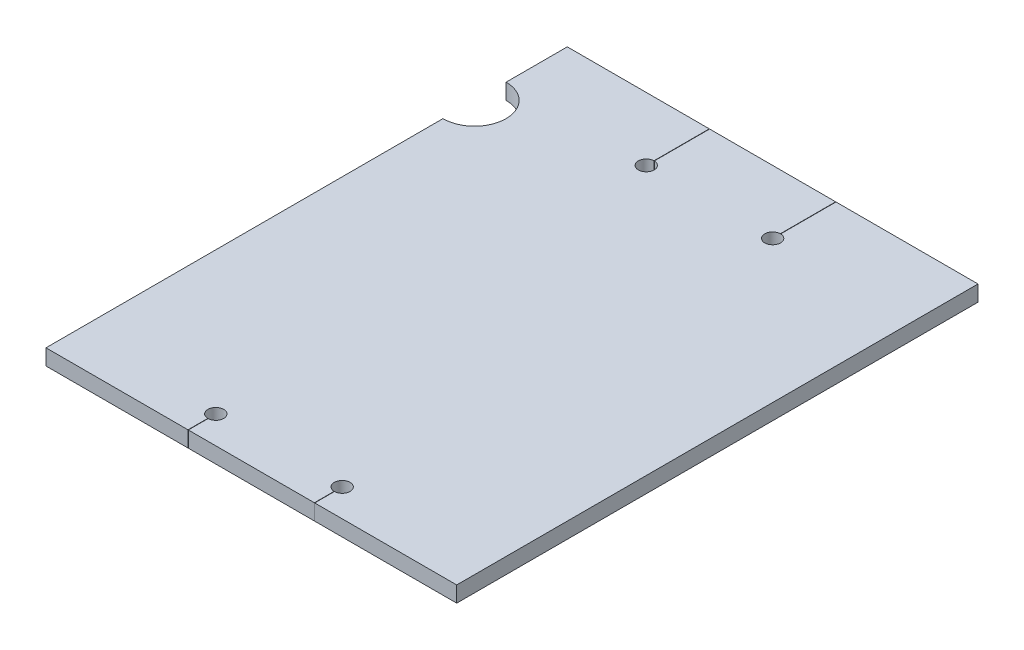
ISO-10303-21;
HEADER;
FILE_DESCRIPTION(('STEP AP214'),'2;1');
FILE_NAME('part.step','',(''),(''),'','','');
FILE_SCHEMA(('AUTOMOTIVE_DESIGN { 1 0 10303 214 1 1 1 1 }'));
ENDSEC;
DATA;
#1=APPLICATION_CONTEXT('core data for automotive mechanical design processes');
#2=APPLICATION_PROTOCOL_DEFINITION('international standard','automotive_design',2000,#1);
#3=PRODUCT_CONTEXT('',#1,'mechanical');
#4=PRODUCT('Part','Part','',(#3));
#5=PRODUCT_RELATED_PRODUCT_CATEGORY('part','',(#4));
#6=PRODUCT_DEFINITION_FORMATION('','',#4);
#7=PRODUCT_DEFINITION_CONTEXT('part definition',#1,'design');
#8=PRODUCT_DEFINITION('design','',#6,#7);
#9=PRODUCT_DEFINITION_SHAPE('','',#8);
#10=(LENGTH_UNIT() NAMED_UNIT(*) SI_UNIT(.MILLI.,.METRE.));
#11=(NAMED_UNIT(*) PLANE_ANGLE_UNIT() SI_UNIT($,.RADIAN.));
#12=(NAMED_UNIT(*) SI_UNIT($,.STERADIAN.) SOLID_ANGLE_UNIT());
#13=UNCERTAINTY_MEASURE_WITH_UNIT(LENGTH_MEASURE(1.E-05),#10,'distance_accuracy_value','');
#14=(GEOMETRIC_REPRESENTATION_CONTEXT(3) GLOBAL_UNCERTAINTY_ASSIGNED_CONTEXT((#13)) GLOBAL_UNIT_ASSIGNED_CONTEXT((#10,
#11,#12)) REPRESENTATION_CONTEXT('',''));
#15=CARTESIAN_POINT('',(0.,0.,0.));
#16=DIRECTION('',(0.,0.,1.));
#17=DIRECTION('',(1.,0.,0.));
#18=AXIS2_PLACEMENT_3D('',#15,#16,#17);
#19=CARTESIAN_POINT('',(-165.1,12.7,-457.2));
#20=DIRECTION('',(0.,-1.,0.));
#21=DIRECTION('',(0.,0.,-1.));
#22=AXIS2_PLACEMENT_3D('',#19,#20,#21);
#23=PLANE('',#22);
#24=DIRECTION('',(0.,0.,1.));
#25=VECTOR('',#24,1.);
#26=CARTESIAN_POINT('',(-50.927,12.7,-53.9762701270254));
#27=LINE('',#26,#25);
#28=CARTESIAN_POINT('',(-50.927,12.7,-53.9762701270254));
#29=VERTEX_POINT('',#28);
#30=CARTESIAN_POINT('',(-50.927,12.7,-38.1));
#31=VERTEX_POINT('',#30);
#32=EDGE_CURVE('E205',#29,#31,#27,.T.);
#33=ORIENTED_EDGE('',*,*,#32,.F.);
#34=CARTESIAN_POINT('',(-50.8,12.7,-60.325));
#35=DIRECTION('',(0.,1.,0.));
#36=DIRECTION('',(0.,0.,1.));
#37=AXIS2_PLACEMENT_3D('',#34,#35,#36);
#38=CIRCLE('',#37,6.35000000000001);
#39=CARTESIAN_POINT('',(-50.673,12.7,-53.9762701270254));
#40=VERTEX_POINT('',#39);
#41=EDGE_CURVE('E195',#40,#29,#38,.T.);
#42=ORIENTED_EDGE('',*,*,#41,.F.);
#43=DIRECTION('',(0.,0.,-1.));
#44=VECTOR('',#43,1.);
#45=CARTESIAN_POINT('',(-50.673,12.7,-53.9762701270254));
#46=LINE('',#45,#44);
#47=CARTESIAN_POINT('',(-50.673,12.7,-38.1));
#48=VERTEX_POINT('',#47);
#49=EDGE_CURVE('E207',#48,#40,#46,.T.);
#50=ORIENTED_EDGE('',*,*,#49,.F.);
#51=DIRECTION('',(-1.,0.,0.));
#52=VECTOR('',#51,1.);
#53=CARTESIAN_POINT('',(-231.560967647059,12.7,-38.1));
#54=LINE('',#53,#52);
#55=CARTESIAN_POINT('',(50.673,12.7,-38.1));
#56=VERTEX_POINT('',#55);
#57=EDGE_CURVE('E282',#56,#48,#54,.T.);
#58=ORIENTED_EDGE('',*,*,#57,.F.);
#59=DIRECTION('',(0.,0.,1.));
#60=VECTOR('',#59,1.);
#61=CARTESIAN_POINT('',(50.673,12.7,-53.9762701270254));
#62=LINE('',#61,#60);
#63=CARTESIAN_POINT('',(50.673,12.7,-53.9762701270254));
#64=VERTEX_POINT('',#63);
#65=EDGE_CURVE('E239',#64,#56,#62,.T.);
#66=ORIENTED_EDGE('',*,*,#65,.F.);
#67=CARTESIAN_POINT('',(50.8,12.7,-60.325));
#68=DIRECTION('',(0.,1.,0.));
#69=DIRECTION('',(0.,0.,-1.));
#70=AXIS2_PLACEMENT_3D('',#67,#68,#69);
#71=CIRCLE('',#70,6.35);
#72=CARTESIAN_POINT('',(50.927,12.7,-53.9762701270254));
#73=VERTEX_POINT('',#72);
#74=EDGE_CURVE('E237',#73,#64,#71,.T.);
#75=ORIENTED_EDGE('',*,*,#74,.F.);
#76=DIRECTION('',(0.,0.,-1.));
#77=VECTOR('',#76,1.);
#78=CARTESIAN_POINT('',(50.927,12.7,-53.9762701270254));
#79=LINE('',#78,#77);
#80=CARTESIAN_POINT('',(50.927,12.7,-38.1));
#81=VERTEX_POINT('',#80);
#82=EDGE_CURVE('E241',#81,#73,#79,.T.);
#83=ORIENTED_EDGE('',*,*,#82,.F.);
#84=CARTESIAN_POINT('',(165.1,12.7,-38.1));
#85=VERTEX_POINT('',#84);
#86=EDGE_CURVE('E278',#85,#81,#54,.T.);
#87=ORIENTED_EDGE('',*,*,#86,.F.);
#88=DIRECTION('',(0.,0.,-1.));
#89=VECTOR('',#88,1.);
#90=CARTESIAN_POINT('',(165.1,12.7,-25.4));
#91=LINE('',#90,#89);
#92=CARTESIAN_POINT('',(165.1,12.7,-457.2));
#93=VERTEX_POINT('',#92);
#94=EDGE_CURVE('E302',#85,#93,#91,.T.);
#95=ORIENTED_EDGE('',*,*,#94,.T.);
#96=DIRECTION('',(-1.,0.,0.));
#97=VECTOR('',#96,1.);
#98=CARTESIAN_POINT('',(-165.1,12.7,-457.2));
#99=LINE('',#98,#97);
#100=CARTESIAN_POINT('',(50.927,12.7,-457.2));
#101=VERTEX_POINT('',#100);
#102=EDGE_CURVE('E305',#93,#101,#99,.T.);
#103=ORIENTED_EDGE('',*,*,#102,.T.);
#104=DIRECTION('',(0.,0.,-1.));
#105=VECTOR('',#104,1.);
#106=CARTESIAN_POINT('',(50.927,12.7,-497.366900495812));
#107=LINE('',#106,#105);
#108=CARTESIAN_POINT('',(50.927,12.7,-412.748729872975));
#109=VERTEX_POINT('',#108);
#110=EDGE_CURVE('E261',#109,#101,#107,.T.);
#111=ORIENTED_EDGE('',*,*,#110,.F.);
#112=CARTESIAN_POINT('',(50.8,12.7,-406.4));
#113=DIRECTION('',(0.,1.,0.));
#114=DIRECTION('',(0.,0.,-1.));
#115=AXIS2_PLACEMENT_3D('',#112,#113,#114);
#116=CIRCLE('',#115,6.34999999999999);
#117=CARTESIAN_POINT('',(50.673,12.7,-412.748729872975));
#118=VERTEX_POINT('',#117);
#119=EDGE_CURVE('E259',#118,#109,#116,.T.);
#120=ORIENTED_EDGE('',*,*,#119,.F.);
#121=DIRECTION('',(0.,0.,1.));
#122=VECTOR('',#121,1.);
#123=CARTESIAN_POINT('',(50.673,12.7,-497.366900495812));
#124=LINE('',#123,#122);
#125=CARTESIAN_POINT('',(50.673,12.7,-457.2));
#126=VERTEX_POINT('',#125);
#127=EDGE_CURVE('E257',#126,#118,#124,.T.);
#128=ORIENTED_EDGE('',*,*,#127,.F.);
#129=CARTESIAN_POINT('',(-50.673,12.7,-457.2));
#130=VERTEX_POINT('',#129);
#131=EDGE_CURVE('E309',#126,#130,#99,.T.);
#132=ORIENTED_EDGE('',*,*,#131,.T.);
#133=DIRECTION('',(0.,0.,-1.));
#134=VECTOR('',#133,1.);
#135=CARTESIAN_POINT('',(-50.673,12.7,-495.604822124658));
#136=LINE('',#135,#134);
#137=CARTESIAN_POINT('',(-50.673,12.7,-412.748729872975));
#138=VERTEX_POINT('',#137);
#139=EDGE_CURVE('E53',#138,#130,#136,.T.);
#140=ORIENTED_EDGE('',*,*,#139,.F.);
#141=CARTESIAN_POINT('',(-50.8,12.7,-406.4));
#142=DIRECTION('',(0.,1.,0.));
#143=DIRECTION('',(0.,0.,1.));
#144=AXIS2_PLACEMENT_3D('',#141,#142,#143);
#145=CIRCLE('',#144,6.35000000000004);
#146=CARTESIAN_POINT('',(-50.927,12.7,-412.748729872975));
#147=VERTEX_POINT('',#146);
#148=EDGE_CURVE('E220',#147,#138,#145,.T.);
#149=ORIENTED_EDGE('',*,*,#148,.F.);
#150=DIRECTION('',(0.,0.,1.));
#151=VECTOR('',#150,1.);
#152=CARTESIAN_POINT('',(-50.927,12.7,-495.604822124658));
#153=LINE('',#152,#151);
#154=CARTESIAN_POINT('',(-50.927,12.7,-457.2));
#155=VERTEX_POINT('',#154);
#156=EDGE_CURVE('E218',#155,#147,#153,.T.);
#157=ORIENTED_EDGE('',*,*,#156,.F.);
#158=CARTESIAN_POINT('',(-165.1,12.7,-457.2));
#159=VERTEX_POINT('',#158);
#160=EDGE_CURVE('E304',#155,#159,#99,.T.);
#161=ORIENTED_EDGE('',*,*,#160,.T.);
#162=DIRECTION('',(0.,0.,1.));
#163=VECTOR('',#162,1.);
#164=CARTESIAN_POINT('',(-165.1,12.7,-25.4));
#165=LINE('',#164,#163);
#166=CARTESIAN_POINT('',(-165.1,12.7,-408.0002));
#167=VERTEX_POINT('',#166);
#168=EDGE_CURVE('E299',#159,#167,#165,.T.);
#169=ORIENTED_EDGE('',*,*,#168,.T.);
#170=CARTESIAN_POINT('',(-165.1,12.7,-382.6002));
#171=DIRECTION('',(0.,1.,0.));
#172=DIRECTION('',(0.,0.,1.));
#173=AXIS2_PLACEMENT_3D('',#170,#171,#172);
#174=CIRCLE('',#173,25.4);
#175=CARTESIAN_POINT('',(-165.1,12.7,-357.2002));
#176=VERTEX_POINT('',#175);
#177=EDGE_CURVE('E271',#176,#167,#174,.T.);
#178=ORIENTED_EDGE('',*,*,#177,.F.);
#179=CARTESIAN_POINT('',(-165.1,12.7,-38.1));
#180=VERTEX_POINT('',#179);
#181=EDGE_CURVE('E297',#176,#180,#165,.T.);
#182=ORIENTED_EDGE('',*,*,#181,.T.);
#183=EDGE_CURVE('E277',#31,#180,#54,.T.);
#184=ORIENTED_EDGE('',*,*,#183,.F.);
#185=EDGE_LOOP('',(#33,#42,#50,#58,#66,#75,#83,#87,#95,#103,#111,#120,#128,#132,#140,#149,#157,
#161,#169,#178,#182,#184));
#186=FACE_BOUND('',#185,.T.);
#187=ADVANCED_FACE('F30',(#186),#23,.F.);
#188=CARTESIAN_POINT('',(-165.1,0.,-457.2));
#189=DIRECTION('',(0.,-1.,0.));
#190=DIRECTION('',(0.,0.,-1.));
#191=AXIS2_PLACEMENT_3D('',#188,#189,#190);
#192=PLANE('',#191);
#193=CARTESIAN_POINT('',(-50.8,0.,-60.325));
#194=DIRECTION('',(0.,1.,0.));
#195=DIRECTION('',(0.,0.,1.));
#196=AXIS2_PLACEMENT_3D('',#193,#194,#195);
#197=CIRCLE('',#196,6.35000000000001);
#198=CARTESIAN_POINT('',(-50.673,0.,-53.9762701270254));
#199=VERTEX_POINT('',#198);
#200=CARTESIAN_POINT('',(-50.927,0.,-53.9762701270254));
#201=VERTEX_POINT('',#200);
#202=EDGE_CURVE('E188',#199,#201,#197,.T.);
#203=ORIENTED_EDGE('',*,*,#202,.T.);
#204=DIRECTION('',(0.,0.,1.));
#205=VECTOR('',#204,1.);
#206=CARTESIAN_POINT('',(-50.927,0.,-53.9762701270254));
#207=LINE('',#206,#205);
#208=CARTESIAN_POINT('',(-50.927,0.,-38.1));
#209=VERTEX_POINT('',#208);
#210=EDGE_CURVE('E180',#201,#209,#207,.T.);
#211=ORIENTED_EDGE('',*,*,#210,.T.);
#212=DIRECTION('',(-1.,0.,0.));
#213=VECTOR('',#212,1.);
#214=CARTESIAN_POINT('',(-165.1,0.,-38.1));
#215=LINE('',#214,#213);
#216=CARTESIAN_POINT('',(-165.1,0.,-38.1));
#217=VERTEX_POINT('',#216);
#218=EDGE_CURVE('E315',#209,#217,#215,.T.);
#219=ORIENTED_EDGE('',*,*,#218,.T.);
#220=DIRECTION('',(0.,0.,1.));
#221=VECTOR('',#220,1.);
#222=CARTESIAN_POINT('',(-165.1,0.,-25.4));
#223=LINE('',#222,#221);
#224=CARTESIAN_POINT('',(-165.1,0.,-357.2002));
#225=VERTEX_POINT('',#224);
#226=EDGE_CURVE('E287',#225,#217,#223,.T.);
#227=ORIENTED_EDGE('',*,*,#226,.F.);
#228=CARTESIAN_POINT('',(-165.1,0.,-382.6002));
#229=DIRECTION('',(0.,1.,0.));
#230=DIRECTION('',(0.,0.,1.));
#231=AXIS2_PLACEMENT_3D('',#228,#229,#230);
#232=CIRCLE('',#231,25.4);
#233=CARTESIAN_POINT('',(-165.1,0.,-408.0002));
#234=VERTEX_POINT('',#233);
#235=EDGE_CURVE('E268',#225,#234,#232,.T.);
#236=ORIENTED_EDGE('',*,*,#235,.T.);
#237=CARTESIAN_POINT('',(-165.1,0.,-457.2));
#238=VERTEX_POINT('',#237);
#239=EDGE_CURVE('E288',#238,#234,#223,.T.);
#240=ORIENTED_EDGE('',*,*,#239,.F.);
#241=DIRECTION('',(-1.,0.,0.));
#242=VECTOR('',#241,1.);
#243=CARTESIAN_POINT('',(-165.1,0.,-457.2));
#244=LINE('',#243,#242);
#245=CARTESIAN_POINT('',(-50.927,0.,-457.2));
#246=VERTEX_POINT('',#245);
#247=EDGE_CURVE('E293',#246,#238,#244,.T.);
#248=ORIENTED_EDGE('',*,*,#247,.F.);
#249=DIRECTION('',(0.,0.,1.));
#250=VECTOR('',#249,1.);
#251=CARTESIAN_POINT('',(-50.927,0.,-495.604822124658));
#252=LINE('',#251,#250);
#253=CARTESIAN_POINT('',(-50.927,0.,-412.748729872975));
#254=VERTEX_POINT('',#253);
#255=EDGE_CURVE('E196',#246,#254,#252,.T.);
#256=ORIENTED_EDGE('',*,*,#255,.T.);
#257=CARTESIAN_POINT('',(-50.8,0.,-406.4));
#258=DIRECTION('',(0.,1.,0.));
#259=DIRECTION('',(0.,0.,1.));
#260=AXIS2_PLACEMENT_3D('',#257,#258,#259);
#261=CIRCLE('',#260,6.35000000000004);
#262=CARTESIAN_POINT('',(-50.673,0.,-412.748729872975));
#263=VERTEX_POINT('',#262);
#264=EDGE_CURVE('E212',#254,#263,#261,.T.);
#265=ORIENTED_EDGE('',*,*,#264,.T.);
#266=DIRECTION('',(0.,0.,-1.));
#267=VECTOR('',#266,1.);
#268=CARTESIAN_POINT('',(-50.673,0.,-495.604822124658));
#269=LINE('',#268,#267);
#270=CARTESIAN_POINT('',(-50.673,0.,-457.2));
#271=VERTEX_POINT('',#270);
#272=EDGE_CURVE('E215',#263,#271,#269,.T.);
#273=ORIENTED_EDGE('',*,*,#272,.T.);
#274=CARTESIAN_POINT('',(50.673,0.,-457.2));
#275=VERTEX_POINT('',#274);
#276=EDGE_CURVE('E298',#275,#271,#244,.T.);
#277=ORIENTED_EDGE('',*,*,#276,.F.);
#278=DIRECTION('',(0.,0.,1.));
#279=VECTOR('',#278,1.);
#280=CARTESIAN_POINT('',(50.673,0.,-497.366900495812));
#281=LINE('',#280,#279);
#282=CARTESIAN_POINT('',(50.673,0.,-412.748729872975));
#283=VERTEX_POINT('',#282);
#284=EDGE_CURVE('E248',#275,#283,#281,.T.);
#285=ORIENTED_EDGE('',*,*,#284,.T.);
#286=CARTESIAN_POINT('',(50.8,0.,-406.4));
#287=DIRECTION('',(0.,1.,0.));
#288=DIRECTION('',(0.,0.,-1.));
#289=AXIS2_PLACEMENT_3D('',#286,#287,#288);
#290=CIRCLE('',#289,6.34999999999999);
#291=CARTESIAN_POINT('',(50.927,0.,-412.748729872975));
#292=VERTEX_POINT('',#291);
#293=EDGE_CURVE('E251',#283,#292,#290,.T.);
#294=ORIENTED_EDGE('',*,*,#293,.T.);
#295=DIRECTION('',(0.,0.,-1.));
#296=VECTOR('',#295,1.);
#297=CARTESIAN_POINT('',(50.927,0.,-497.366900495812));
#298=LINE('',#297,#296);
#299=CARTESIAN_POINT('',(50.927,0.,-457.2));
#300=VERTEX_POINT('',#299);
#301=EDGE_CURVE('E254',#292,#300,#298,.T.);
#302=ORIENTED_EDGE('',*,*,#301,.T.);
#303=CARTESIAN_POINT('',(165.1,0.,-457.2));
#304=VERTEX_POINT('',#303);
#305=EDGE_CURVE('E294',#304,#300,#244,.T.);
#306=ORIENTED_EDGE('',*,*,#305,.F.);
#307=DIRECTION('',(0.,0.,-1.));
#308=VECTOR('',#307,1.);
#309=CARTESIAN_POINT('',(165.1,0.,-25.4));
#310=LINE('',#309,#308);
#311=CARTESIAN_POINT('',(165.1,0.,-38.1));
#312=VERTEX_POINT('',#311);
#313=EDGE_CURVE('E291',#312,#304,#310,.T.);
#314=ORIENTED_EDGE('',*,*,#313,.F.);
#315=CARTESIAN_POINT('',(50.927,0.,-38.1));
#316=VERTEX_POINT('',#315);
#317=EDGE_CURVE('E316',#312,#316,#215,.T.);
#318=ORIENTED_EDGE('',*,*,#317,.T.);
#319=DIRECTION('',(0.,0.,-1.));
#320=VECTOR('',#319,1.);
#321=CARTESIAN_POINT('',(50.927,0.,-53.9762701270254));
#322=LINE('',#321,#320);
#323=CARTESIAN_POINT('',(50.927,0.,-53.9762701270254));
#324=VERTEX_POINT('',#323);
#325=EDGE_CURVE('E234',#316,#324,#322,.T.);
#326=ORIENTED_EDGE('',*,*,#325,.T.);
#327=CARTESIAN_POINT('',(50.8,0.,-60.325));
#328=DIRECTION('',(0.,1.,0.));
#329=DIRECTION('',(0.,0.,-1.));
#330=AXIS2_PLACEMENT_3D('',#327,#328,#329);
#331=CIRCLE('',#330,6.35);
#332=CARTESIAN_POINT('',(50.673,0.,-53.9762701270254));
#333=VERTEX_POINT('',#332);
#334=EDGE_CURVE('E228',#324,#333,#331,.T.);
#335=ORIENTED_EDGE('',*,*,#334,.T.);
#336=DIRECTION('',(0.,0.,1.));
#337=VECTOR('',#336,1.);
#338=CARTESIAN_POINT('',(50.673,0.,-53.9762701270254));
#339=LINE('',#338,#337);
#340=CARTESIAN_POINT('',(50.673,0.,-38.1));
#341=VERTEX_POINT('',#340);
#342=EDGE_CURVE('E231',#333,#341,#339,.T.);
#343=ORIENTED_EDGE('',*,*,#342,.T.);
#344=CARTESIAN_POINT('',(-50.673,0.,-38.1));
#345=VERTEX_POINT('',#344);
#346=EDGE_CURVE('E320',#341,#345,#215,.T.);
#347=ORIENTED_EDGE('',*,*,#346,.T.);
#348=DIRECTION('',(0.,0.,-1.));
#349=VECTOR('',#348,1.);
#350=CARTESIAN_POINT('',(-50.673,0.,-53.9762701270254));
#351=LINE('',#350,#349);
#352=EDGE_CURVE('E45',#345,#199,#351,.T.);
#353=ORIENTED_EDGE('',*,*,#352,.T.);
#354=EDGE_LOOP('',(#203,#211,#219,#227,#236,#240,#248,#256,#265,#273,#277,#285,#294,#302,#306,
#314,#318,#326,#335,#343,#347,#353));
#355=FACE_BOUND('',#354,.T.);
#356=ADVANCED_FACE('F199',(#355),#192,.T.);
#357=CARTESIAN_POINT('',(-231.560967647059,12.7,-38.1));
#358=DIRECTION('',(0.,0.,1.));
#359=DIRECTION('',(1.,0.,0.));
#360=AXIS2_PLACEMENT_3D('',#357,#358,#359);
#361=PLANE('',#360);
#362=ORIENTED_EDGE('',*,*,#218,.F.);
#363=DIRECTION('',(0.,1.,0.));
#364=VECTOR('',#363,1.);
#365=CARTESIAN_POINT('',(-50.927,12.7,-38.1));
#366=LINE('',#365,#364);
#367=EDGE_CURVE('E11',#209,#31,#366,.T.);
#368=ORIENTED_EDGE('',*,*,#367,.T.);
#369=ORIENTED_EDGE('',*,*,#183,.T.);
#370=DIRECTION('',(0.,-1.,0.));
#371=VECTOR('',#370,1.);
#372=CARTESIAN_POINT('',(-165.1,12.7,-38.1));
#373=LINE('',#372,#371);
#374=EDGE_CURVE('E284',#180,#217,#373,.T.);
#375=ORIENTED_EDGE('',*,*,#374,.T.);
#376=EDGE_LOOP('',(#362,#368,#369,#375));
#377=FACE_BOUND('',#376,.T.);
#378=ADVANCED_FACE('F346',(#377),#361,.T.);
#379=ORIENTED_EDGE('',*,*,#57,.T.);
#380=DIRECTION('',(0.,-1.,0.));
#381=VECTOR('',#380,1.);
#382=CARTESIAN_POINT('',(-50.673,12.7,-38.1));
#383=LINE('',#382,#381);
#384=EDGE_CURVE('E38',#48,#345,#383,.T.);
#385=ORIENTED_EDGE('',*,*,#384,.T.);
#386=ORIENTED_EDGE('',*,*,#346,.F.);
#387=DIRECTION('',(0.,1.,0.));
#388=VECTOR('',#387,1.);
#389=CARTESIAN_POINT('',(50.673,12.7,-38.1));
#390=LINE('',#389,#388);
#391=EDGE_CURVE('E327',#341,#56,#390,.T.);
#392=ORIENTED_EDGE('',*,*,#391,.T.);
#393=EDGE_LOOP('',(#379,#385,#386,#392));
#394=FACE_BOUND('',#393,.T.);
#395=ADVANCED_FACE('F336',(#394),#361,.T.);
#396=CARTESIAN_POINT('',(-165.1,12.7,-457.2));
#397=DIRECTION('',(0.,0.,1.));
#398=DIRECTION('',(1.,0.,0.));
#399=AXIS2_PLACEMENT_3D('',#396,#397,#398);
#400=PLANE('',#399);
#401=DIRECTION('',(0.,1.,0.));
#402=VECTOR('',#401,1.);
#403=CARTESIAN_POINT('',(-50.927,12.7,-457.2));
#404=LINE('',#403,#402);
#405=EDGE_CURVE('E332',#246,#155,#404,.T.);
#406=ORIENTED_EDGE('',*,*,#405,.F.);
#407=ORIENTED_EDGE('',*,*,#247,.T.);
#408=DIRECTION('',(0.,-1.,0.));
#409=VECTOR('',#408,1.);
#410=CARTESIAN_POINT('',(-165.1,12.7,-457.2));
#411=LINE('',#410,#409);
#412=EDGE_CURVE('E308',#159,#238,#411,.T.);
#413=ORIENTED_EDGE('',*,*,#412,.F.);
#414=ORIENTED_EDGE('',*,*,#160,.F.);
#415=EDGE_LOOP('',(#406,#407,#413,#414));
#416=FACE_BOUND('',#415,.T.);
#417=ADVANCED_FACE('F377',(#416),#400,.F.);
#418=DIRECTION('',(0.,-1.,0.));
#419=VECTOR('',#418,1.);
#420=CARTESIAN_POINT('',(-50.673,12.7,-457.2));
#421=LINE('',#420,#419);
#422=EDGE_CURVE('E330',#130,#271,#421,.T.);
#423=ORIENTED_EDGE('',*,*,#422,.F.);
#424=ORIENTED_EDGE('',*,*,#131,.F.);
#425=DIRECTION('',(0.,1.,0.));
#426=VECTOR('',#425,1.);
#427=CARTESIAN_POINT('',(50.673,12.7,-457.2));
#428=LINE('',#427,#426);
#429=EDGE_CURVE('E322',#275,#126,#428,.T.);
#430=ORIENTED_EDGE('',*,*,#429,.F.);
#431=ORIENTED_EDGE('',*,*,#276,.T.);
#432=EDGE_LOOP('',(#423,#424,#430,#431));
#433=FACE_BOUND('',#432,.T.);
#434=ADVANCED_FACE('F366',(#433),#400,.F.);
#435=ORIENTED_EDGE('',*,*,#86,.T.);
#436=DIRECTION('',(0.,-1.,0.));
#437=VECTOR('',#436,1.);
#438=CARTESIAN_POINT('',(50.927,12.7,-38.1));
#439=LINE('',#438,#437);
#440=EDGE_CURVE('E324',#81,#316,#439,.T.);
#441=ORIENTED_EDGE('',*,*,#440,.T.);
#442=ORIENTED_EDGE('',*,*,#317,.F.);
#443=DIRECTION('',(0.,1.,0.));
#444=VECTOR('',#443,1.);
#445=CARTESIAN_POINT('',(165.1,12.7,-38.1));
#446=LINE('',#445,#444);
#447=EDGE_CURVE('E281',#312,#85,#446,.T.);
#448=ORIENTED_EDGE('',*,*,#447,.T.);
#449=EDGE_LOOP('',(#435,#441,#442,#448));
#450=FACE_BOUND('',#449,.T.);
#451=ADVANCED_FACE('F385',(#450),#361,.T.);
#452=DIRECTION('',(0.,-1.,0.));
#453=VECTOR('',#452,1.);
#454=CARTESIAN_POINT('',(50.927,12.7,-457.2));
#455=LINE('',#454,#453);
#456=EDGE_CURVE('E319',#101,#300,#455,.T.);
#457=ORIENTED_EDGE('',*,*,#456,.F.);
#458=ORIENTED_EDGE('',*,*,#102,.F.);
#459=DIRECTION('',(0.,-1.,0.));
#460=VECTOR('',#459,1.);
#461=CARTESIAN_POINT('',(165.1,12.7,-457.2));
#462=LINE('',#461,#460);
#463=EDGE_CURVE('E312',#93,#304,#462,.T.);
#464=ORIENTED_EDGE('',*,*,#463,.T.);
#465=ORIENTED_EDGE('',*,*,#305,.T.);
#466=EDGE_LOOP('',(#457,#458,#464,#465));
#467=FACE_BOUND('',#466,.T.);
#468=ADVANCED_FACE('F380',(#467),#400,.F.);
#469=CARTESIAN_POINT('',(-165.1,12.7,-25.4));
#470=DIRECTION('',(1.,0.,0.));
#471=DIRECTION('',(0.,0.,-1.));
#472=AXIS2_PLACEMENT_3D('',#469,#470,#471);
#473=PLANE('',#472);
#474=DIRECTION('',(0.,-1.,0.));
#475=VECTOR('',#474,1.);
#476=CARTESIAN_POINT('',(-165.1,12.7,-357.2002));
#477=LINE('',#476,#475);
#478=EDGE_CURVE('E275',#225,#176,#477,.F.);
#479=ORIENTED_EDGE('',*,*,#478,.F.);
#480=ORIENTED_EDGE('',*,*,#226,.T.);
#481=ORIENTED_EDGE('',*,*,#374,.F.);
#482=ORIENTED_EDGE('',*,*,#181,.F.);
#483=EDGE_LOOP('',(#479,#480,#481,#482));
#484=FACE_BOUND('',#483,.T.);
#485=ADVANCED_FACE('F32',(#484),#473,.F.);
#486=DIRECTION('',(0.,-1.,0.));
#487=VECTOR('',#486,1.);
#488=CARTESIAN_POINT('',(-165.1,12.7,-408.0002));
#489=LINE('',#488,#487);
#490=EDGE_CURVE('E273',#167,#234,#489,.T.);
#491=ORIENTED_EDGE('',*,*,#490,.F.);
#492=ORIENTED_EDGE('',*,*,#168,.F.);
#493=ORIENTED_EDGE('',*,*,#412,.T.);
#494=ORIENTED_EDGE('',*,*,#239,.T.);
#495=EDGE_LOOP('',(#491,#492,#493,#494));
#496=FACE_BOUND('',#495,.T.);
#497=ADVANCED_FACE('F356',(#496),#473,.F.);
#498=CARTESIAN_POINT('',(165.1,12.7,-25.4));
#499=DIRECTION('',(-1.,0.,0.));
#500=DIRECTION('',(0.,0.,1.));
#501=AXIS2_PLACEMENT_3D('',#498,#499,#500);
#502=PLANE('',#501);
#503=ORIENTED_EDGE('',*,*,#447,.F.);
#504=ORIENTED_EDGE('',*,*,#313,.T.);
#505=ORIENTED_EDGE('',*,*,#463,.F.);
#506=ORIENTED_EDGE('',*,*,#94,.F.);
#507=EDGE_LOOP('',(#503,#504,#505,#506));
#508=FACE_BOUND('',#507,.T.);
#509=ADVANCED_FACE('F400',(#508),#502,.F.);
#510=CARTESIAN_POINT('',(-165.1,12.7,-382.6002));
#511=DIRECTION('',(0.,-1.,0.));
#512=DIRECTION('',(0.,0.,-1.));
#513=AXIS2_PLACEMENT_3D('',#510,#511,#512);
#514=CYLINDRICAL_SURFACE('',#513,25.4);
#515=ORIENTED_EDGE('',*,*,#478,.T.);
#516=ORIENTED_EDGE('',*,*,#177,.T.);
#517=ORIENTED_EDGE('',*,*,#490,.T.);
#518=ORIENTED_EDGE('',*,*,#235,.F.);
#519=EDGE_LOOP('',(#515,#516,#517,#518));
#520=FACE_BOUND('',#519,.T.);
#521=ADVANCED_FACE('F354',(#520),#514,.F.);
#522=CARTESIAN_POINT('',(50.673,12.7,-497.366900495812));
#523=DIRECTION('',(1.,0.,0.));
#524=DIRECTION('',(0.,0.,-1.));
#525=AXIS2_PLACEMENT_3D('',#522,#523,#524);
#526=PLANE('',#525);
#527=ORIENTED_EDGE('',*,*,#429,.T.);
#528=ORIENTED_EDGE('',*,*,#127,.T.);
#529=DIRECTION('',(0.,-1.,0.));
#530=VECTOR('',#529,1.);
#531=CARTESIAN_POINT('',(50.673,12.7,-412.748729872975));
#532=LINE('',#531,#530);
#533=EDGE_CURVE('E265',#118,#283,#532,.T.);
#534=ORIENTED_EDGE('',*,*,#533,.T.);
#535=ORIENTED_EDGE('',*,*,#284,.F.);
#536=EDGE_LOOP('',(#527,#528,#534,#535));
#537=FACE_BOUND('',#536,.T.);
#538=ADVANCED_FACE('F399',(#537),#526,.T.);
#539=CARTESIAN_POINT('',(50.927,12.7,-497.366900495812));
#540=DIRECTION('',(-1.,0.,0.));
#541=DIRECTION('',(0.,0.,1.));
#542=AXIS2_PLACEMENT_3D('',#539,#540,#541);
#543=PLANE('',#542);
#544=ORIENTED_EDGE('',*,*,#456,.T.);
#545=ORIENTED_EDGE('',*,*,#301,.F.);
#546=DIRECTION('',(0.,-1.,0.));
#547=VECTOR('',#546,1.);
#548=CARTESIAN_POINT('',(50.927,12.7,-412.748729872975));
#549=LINE('',#548,#547);
#550=EDGE_CURVE('E263',#109,#292,#549,.T.);
#551=ORIENTED_EDGE('',*,*,#550,.F.);
#552=ORIENTED_EDGE('',*,*,#110,.T.);
#553=EDGE_LOOP('',(#544,#545,#551,#552));
#554=FACE_BOUND('',#553,.T.);
#555=ADVANCED_FACE('F403',(#554),#543,.T.);
#556=CARTESIAN_POINT('',(50.8,12.7,-406.4));
#557=DIRECTION('',(0.,-1.,0.));
#558=DIRECTION('',(0.,0.,-1.));
#559=AXIS2_PLACEMENT_3D('',#556,#557,#558);
#560=CYLINDRICAL_SURFACE('',#559,6.34999999999999);
#561=ORIENTED_EDGE('',*,*,#293,.F.);
#562=ORIENTED_EDGE('',*,*,#533,.F.);
#563=ORIENTED_EDGE('',*,*,#119,.T.);
#564=ORIENTED_EDGE('',*,*,#550,.T.);
#565=EDGE_LOOP('',(#561,#562,#563,#564));
#566=FACE_BOUND('',#565,.T.);
#567=ADVANCED_FACE('F405',(#566),#560,.F.);
#568=CARTESIAN_POINT('',(50.8,12.7,-60.325));
#569=DIRECTION('',(0.,-1.,0.));
#570=DIRECTION('',(0.,0.,-1.));
#571=AXIS2_PLACEMENT_3D('',#568,#569,#570);
#572=CYLINDRICAL_SURFACE('',#571,6.35);
#573=ORIENTED_EDGE('',*,*,#334,.F.);
#574=DIRECTION('',(0.,-1.,0.));
#575=VECTOR('',#574,1.);
#576=CARTESIAN_POINT('',(50.927,12.7,-53.9762701270254));
#577=LINE('',#576,#575);
#578=EDGE_CURVE('E243',#73,#324,#577,.T.);
#579=ORIENTED_EDGE('',*,*,#578,.F.);
#580=ORIENTED_EDGE('',*,*,#74,.T.);
#581=DIRECTION('',(0.,-1.,0.));
#582=VECTOR('',#581,1.);
#583=CARTESIAN_POINT('',(50.673,12.7,-53.9762701270254));
#584=LINE('',#583,#582);
#585=EDGE_CURVE('E245',#64,#333,#584,.T.);
#586=ORIENTED_EDGE('',*,*,#585,.T.);
#587=EDGE_LOOP('',(#573,#579,#580,#586));
#588=FACE_BOUND('',#587,.T.);
#589=ADVANCED_FACE('F408',(#588),#572,.F.);
#590=CARTESIAN_POINT('',(50.673,12.7,-53.9762701270254));
#591=DIRECTION('',(1.,0.,0.));
#592=DIRECTION('',(0.,0.,-1.));
#593=AXIS2_PLACEMENT_3D('',#590,#591,#592);
#594=PLANE('',#593);
#595=ORIENTED_EDGE('',*,*,#342,.F.);
#596=ORIENTED_EDGE('',*,*,#585,.F.);
#597=ORIENTED_EDGE('',*,*,#65,.T.);
#598=ORIENTED_EDGE('',*,*,#391,.F.);
#599=EDGE_LOOP('',(#595,#596,#597,#598));
#600=FACE_BOUND('',#599,.T.);
#601=ADVANCED_FACE('F415',(#600),#594,.T.);
#602=CARTESIAN_POINT('',(50.927,12.7,-53.9762701270254));
#603=DIRECTION('',(-1.,0.,0.));
#604=DIRECTION('',(0.,0.,1.));
#605=AXIS2_PLACEMENT_3D('',#602,#603,#604);
#606=PLANE('',#605);
#607=ORIENTED_EDGE('',*,*,#82,.T.);
#608=ORIENTED_EDGE('',*,*,#578,.T.);
#609=ORIENTED_EDGE('',*,*,#325,.F.);
#610=ORIENTED_EDGE('',*,*,#440,.F.);
#611=EDGE_LOOP('',(#607,#608,#609,#610));
#612=FACE_BOUND('',#611,.T.);
#613=ADVANCED_FACE('F419',(#612),#606,.T.);
#614=CARTESIAN_POINT('',(-50.927,12.7,-495.604822124658));
#615=DIRECTION('',(1.,0.,0.));
#616=DIRECTION('',(0.,0.,-1.));
#617=AXIS2_PLACEMENT_3D('',#614,#615,#616);
#618=PLANE('',#617);
#619=ORIENTED_EDGE('',*,*,#405,.T.);
#620=ORIENTED_EDGE('',*,*,#156,.T.);
#621=DIRECTION('',(0.,-1.,0.));
#622=VECTOR('',#621,1.);
#623=CARTESIAN_POINT('',(-50.927,12.7,-412.748729872975));
#624=LINE('',#623,#622);
#625=EDGE_CURVE('E225',#147,#254,#624,.T.);
#626=ORIENTED_EDGE('',*,*,#625,.T.);
#627=ORIENTED_EDGE('',*,*,#255,.F.);
#628=EDGE_LOOP('',(#619,#620,#626,#627));
#629=FACE_BOUND('',#628,.T.);
#630=ADVANCED_FACE('F423',(#629),#618,.T.);
#631=CARTESIAN_POINT('',(-50.673,12.7,-495.604822124658));
#632=DIRECTION('',(-1.,0.,0.));
#633=DIRECTION('',(0.,0.,1.));
#634=AXIS2_PLACEMENT_3D('',#631,#632,#633);
#635=PLANE('',#634);
#636=ORIENTED_EDGE('',*,*,#422,.T.);
#637=ORIENTED_EDGE('',*,*,#272,.F.);
#638=DIRECTION('',(0.,-1.,0.));
#639=VECTOR('',#638,1.);
#640=CARTESIAN_POINT('',(-50.673,12.7,-412.748729872975));
#641=LINE('',#640,#639);
#642=EDGE_CURVE('E223',#138,#263,#641,.T.);
#643=ORIENTED_EDGE('',*,*,#642,.F.);
#644=ORIENTED_EDGE('',*,*,#139,.T.);
#645=EDGE_LOOP('',(#636,#637,#643,#644));
#646=FACE_BOUND('',#645,.T.);
#647=ADVANCED_FACE('F370',(#646),#635,.T.);
#648=CARTESIAN_POINT('',(-50.8,12.7,-406.4));
#649=DIRECTION('',(0.,-1.,0.));
#650=DIRECTION('',(0.,0.,-1.));
#651=AXIS2_PLACEMENT_3D('',#648,#649,#650);
#652=CYLINDRICAL_SURFACE('',#651,6.35000000000004);
#653=ORIENTED_EDGE('',*,*,#264,.F.);
#654=ORIENTED_EDGE('',*,*,#625,.F.);
#655=ORIENTED_EDGE('',*,*,#148,.T.);
#656=ORIENTED_EDGE('',*,*,#642,.T.);
#657=EDGE_LOOP('',(#653,#654,#655,#656));
#658=FACE_BOUND('',#657,.T.);
#659=ADVANCED_FACE('F428',(#658),#652,.F.);
#660=CARTESIAN_POINT('',(-50.8,12.7,-60.325));
#661=DIRECTION('',(0.,-1.,0.));
#662=DIRECTION('',(0.,0.,-1.));
#663=AXIS2_PLACEMENT_3D('',#660,#661,#662);
#664=CYLINDRICAL_SURFACE('',#663,6.35000000000001);
#665=ORIENTED_EDGE('',*,*,#202,.F.);
#666=DIRECTION('',(0.,-1.,0.));
#667=VECTOR('',#666,1.);
#668=CARTESIAN_POINT('',(-50.673,12.7,-53.9762701270254));
#669=LINE('',#668,#667);
#670=EDGE_CURVE('E197',#40,#199,#669,.T.);
#671=ORIENTED_EDGE('',*,*,#670,.F.);
#672=ORIENTED_EDGE('',*,*,#41,.T.);
#673=DIRECTION('',(0.,-1.,0.));
#674=VECTOR('',#673,1.);
#675=CARTESIAN_POINT('',(-50.927,12.7,-53.9762701270254));
#676=LINE('',#675,#674);
#677=EDGE_CURVE('E183',#29,#201,#676,.T.);
#678=ORIENTED_EDGE('',*,*,#677,.T.);
#679=EDGE_LOOP('',(#665,#671,#672,#678));
#680=FACE_BOUND('',#679,.T.);
#681=ADVANCED_FACE('F192',(#680),#664,.F.);
#682=CARTESIAN_POINT('',(-50.927,12.7,-53.9762701270254));
#683=DIRECTION('',(1.,0.,0.));
#684=DIRECTION('',(0.,0.,-1.));
#685=AXIS2_PLACEMENT_3D('',#682,#683,#684);
#686=PLANE('',#685);
#687=ORIENTED_EDGE('',*,*,#210,.F.);
#688=ORIENTED_EDGE('',*,*,#677,.F.);
#689=ORIENTED_EDGE('',*,*,#32,.T.);
#690=ORIENTED_EDGE('',*,*,#367,.F.);
#691=EDGE_LOOP('',(#687,#688,#689,#690));
#692=FACE_BOUND('',#691,.T.);
#693=ADVANCED_FACE('F182',(#692),#686,.T.);
#694=CARTESIAN_POINT('',(-50.673,12.7,-53.9762701270254));
#695=DIRECTION('',(-1.,0.,0.));
#696=DIRECTION('',(0.,0.,1.));
#697=AXIS2_PLACEMENT_3D('',#694,#695,#696);
#698=PLANE('',#697);
#699=ORIENTED_EDGE('',*,*,#49,.T.);
#700=ORIENTED_EDGE('',*,*,#670,.T.);
#701=ORIENTED_EDGE('',*,*,#352,.F.);
#702=ORIENTED_EDGE('',*,*,#384,.F.);
#703=EDGE_LOOP('',(#699,#700,#701,#702));
#704=FACE_BOUND('',#703,.T.);
#705=ADVANCED_FACE('F437',(#704),#698,.T.);
#706=CLOSED_SHELL('',(#187,#356,#378,#395,#417,#434,#451,#468,#485,#497,#509,#521,#538,#555,
#567,#589,#601,#613,#630,#647,#659,#681,#693,#705));
#707=MANIFOLD_SOLID_BREP('B2',#706);
#708=ADVANCED_BREP_SHAPE_REPRESENTATION('',(#18,#707),#14);
#709=SHAPE_DEFINITION_REPRESENTATION(#9,#708);
ENDSEC;
END-ISO-10303-21;
